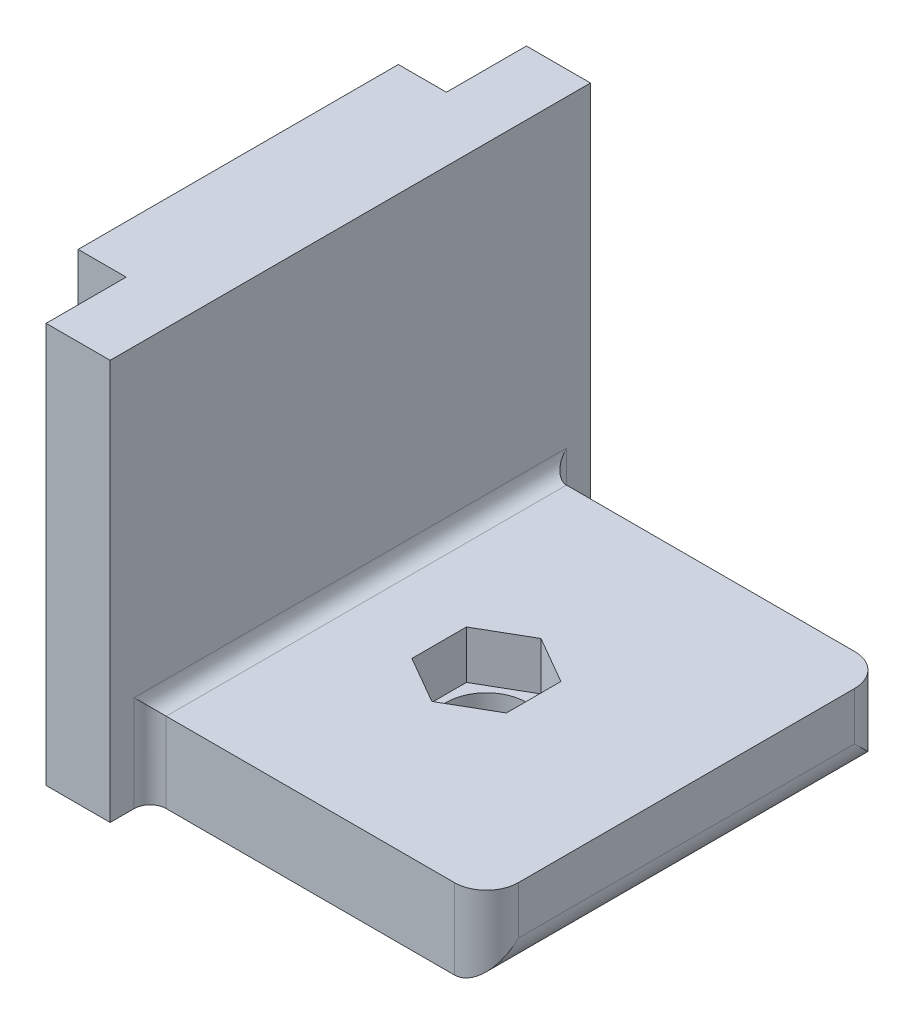
ISO-10303-21;
HEADER;
FILE_DESCRIPTION(('STEP AP214'),'2;1');
FILE_NAME('part.step','',(''),(''),'','','');
FILE_SCHEMA(('AUTOMOTIVE_DESIGN { 1 0 10303 214 1 1 1 1 }'));
ENDSEC;
DATA;
#1=APPLICATION_CONTEXT('core data for automotive mechanical design processes');
#2=APPLICATION_PROTOCOL_DEFINITION('international standard','automotive_design',2000,#1);
#3=PRODUCT_CONTEXT('',#1,'mechanical');
#4=PRODUCT('Part','Part','',(#3));
#5=PRODUCT_RELATED_PRODUCT_CATEGORY('part','',(#4));
#6=PRODUCT_DEFINITION_FORMATION('','',#4);
#7=PRODUCT_DEFINITION_CONTEXT('part definition',#1,'design');
#8=PRODUCT_DEFINITION('design','',#6,#7);
#9=PRODUCT_DEFINITION_SHAPE('','',#8);
#10=(LENGTH_UNIT() NAMED_UNIT(*) SI_UNIT(.MILLI.,.METRE.));
#11=(NAMED_UNIT(*) PLANE_ANGLE_UNIT() SI_UNIT($,.RADIAN.));
#12=(NAMED_UNIT(*) SI_UNIT($,.STERADIAN.) SOLID_ANGLE_UNIT());
#13=UNCERTAINTY_MEASURE_WITH_UNIT(LENGTH_MEASURE(1.E-05),#10,'distance_accuracy_value','');
#14=(GEOMETRIC_REPRESENTATION_CONTEXT(3) GLOBAL_UNCERTAINTY_ASSIGNED_CONTEXT((#13)) GLOBAL_UNIT_ASSIGNED_CONTEXT((#10,
#11,#12)) REPRESENTATION_CONTEXT('',''));
#15=CARTESIAN_POINT('',(0.,0.,0.));
#16=DIRECTION('',(0.,0.,1.));
#17=DIRECTION('',(1.,0.,0.));
#18=AXIS2_PLACEMENT_3D('',#15,#16,#17);
#19=CARTESIAN_POINT('',(0.,25.,0.));
#20=DIRECTION('',(0.,-1.,0.));
#21=DIRECTION('',(0.,0.,-1.));
#22=AXIS2_PLACEMENT_3D('',#19,#20,#21);
#23=CYLINDRICAL_SURFACE('',#22,2.50000000000002);
#24=CARTESIAN_POINT('',(0.,1.,0.));
#25=DIRECTION('',(0.,-1.,0.));
#26=DIRECTION('',(0.,0.,-1.));
#27=AXIS2_PLACEMENT_3D('',#24,#25,#26);
#28=CIRCLE('',#27,2.50000000000002);
#29=CARTESIAN_POINT('',(0.,1.,-2.50000000000002));
#30=VERTEX_POINT('',#29);
#31=EDGE_CURVE('E323',#30,#30,#28,.T.);
#32=ORIENTED_EDGE('',*,*,#31,.T.);
#33=EDGE_LOOP('',(#32));
#34=FACE_BOUND('',#33,.T.);
#35=CARTESIAN_POINT('',(0.,2.,0.));
#36=DIRECTION('',(0.,1.,0.));
#37=DIRECTION('',(0.,0.,1.));
#38=AXIS2_PLACEMENT_3D('',#35,#36,#37);
#39=CIRCLE('',#38,2.50000000000002);
#40=CARTESIAN_POINT('',(0.,2.,2.50000000000002));
#41=VERTEX_POINT('',#40);
#42=EDGE_CURVE('E42',#41,#41,#39,.F.);
#43=ORIENTED_EDGE('',*,*,#42,.F.);
#44=EDGE_LOOP('',(#43));
#45=FACE_BOUND('',#44,.T.);
#46=ADVANCED_FACE('F38',(#34,#45),#23,.F.);
#47=CARTESIAN_POINT('',(0.,5.,0.));
#48=DIRECTION('',(0.,-1.,0.));
#49=DIRECTION('',(0.,0.,-1.));
#50=AXIS2_PLACEMENT_3D('',#47,#48,#49);
#51=PLANE('',#50);
#52=DIRECTION('',(-0.866025403784438,0.,-0.5));
#53=VECTOR('',#52,1.);
#54=CARTESIAN_POINT('',(2.95,5.,-1.7031832941094));
#55=LINE('',#54,#53);
#56=CARTESIAN_POINT('',(2.95,5.,-1.7031832941094));
#57=VERTEX_POINT('',#56);
#58=CARTESIAN_POINT('',(0.,5.,-3.40636658821879));
#59=VERTEX_POINT('',#58);
#60=EDGE_CURVE('E225',#57,#59,#55,.T.);
#61=ORIENTED_EDGE('',*,*,#60,.F.);
#62=DIRECTION('',(0.,0.,-1.));
#63=VECTOR('',#62,1.);
#64=CARTESIAN_POINT('',(2.95,5.,1.7031832941094));
#65=LINE('',#64,#63);
#66=CARTESIAN_POINT('',(2.95,5.,1.7031832941094));
#67=VERTEX_POINT('',#66);
#68=EDGE_CURVE('E55',#67,#57,#65,.T.);
#69=ORIENTED_EDGE('',*,*,#68,.F.);
#70=DIRECTION('',(0.866025403784439,0.,-0.5));
#71=VECTOR('',#70,1.);
#72=CARTESIAN_POINT('',(0.,5.,3.40636658821879));
#73=LINE('',#72,#71);
#74=CARTESIAN_POINT('',(0.,5.,3.40636658821879));
#75=VERTEX_POINT('',#74);
#76=EDGE_CURVE('E211',#75,#67,#73,.T.);
#77=ORIENTED_EDGE('',*,*,#76,.F.);
#78=DIRECTION('',(0.866025403784438,0.,0.5));
#79=VECTOR('',#78,1.);
#80=CARTESIAN_POINT('',(-2.95,5.,1.7031832941094));
#81=LINE('',#80,#79);
#82=CARTESIAN_POINT('',(-2.95,5.,1.7031832941094));
#83=VERTEX_POINT('',#82);
#84=EDGE_CURVE('E214',#83,#75,#81,.T.);
#85=ORIENTED_EDGE('',*,*,#84,.F.);
#86=DIRECTION('',(0.,0.,1.));
#87=VECTOR('',#86,1.);
#88=CARTESIAN_POINT('',(-2.95,5.,-1.7031832941094));
#89=LINE('',#88,#87);
#90=CARTESIAN_POINT('',(-2.95,5.,-1.7031832941094));
#91=VERTEX_POINT('',#90);
#92=EDGE_CURVE('E230',#91,#83,#89,.T.);
#93=ORIENTED_EDGE('',*,*,#92,.F.);
#94=DIRECTION('',(-0.866025403784439,0.,0.5));
#95=VECTOR('',#94,1.);
#96=CARTESIAN_POINT('',(0.,5.,-3.40636658821879));
#97=LINE('',#96,#95);
#98=EDGE_CURVE('E227',#59,#91,#97,.T.);
#99=ORIENTED_EDGE('',*,*,#98,.F.);
#100=EDGE_LOOP('',(#61,#69,#77,#85,#93,#99));
#101=FACE_BOUND('',#100,.T.);
#102=DIRECTION('',(0.,0.,-1.));
#103=VECTOR('',#102,1.);
#104=CARTESIAN_POINT('',(12.5,5.,-12.5));
#105=LINE('',#104,#103);
#106=CARTESIAN_POINT('',(12.5,5.,10.5));
#107=VERTEX_POINT('',#106);
#108=CARTESIAN_POINT('',(12.5,5.,-10.5));
#109=VERTEX_POINT('',#108);
#110=EDGE_CURVE('E272',#107,#109,#105,.T.);
#111=ORIENTED_EDGE('',*,*,#110,.T.);
#112=CARTESIAN_POINT('',(10.5,5.,-10.5));
#113=DIRECTION('',(0.,-1.,0.));
#114=DIRECTION('',(0.,0.,-1.));
#115=AXIS2_PLACEMENT_3D('',#112,#113,#114);
#116=CIRCLE('',#115,2.);
#117=CARTESIAN_POINT('',(10.5,5.,-12.5));
#118=VERTEX_POINT('',#117);
#119=EDGE_CURVE('E47',#109,#118,#116,.F.);
#120=ORIENTED_EDGE('',*,*,#119,.T.);
#121=DIRECTION('',(-1.,0.,0.));
#122=VECTOR('',#121,1.);
#123=CARTESIAN_POINT('',(-8.50000000000001,5.,-12.5));
#124=LINE('',#123,#122);
#125=CARTESIAN_POINT('',(-7.50000000000001,5.,-12.5));
#126=VERTEX_POINT('',#125);
#127=EDGE_CURVE('E276',#118,#126,#124,.T.);
#128=ORIENTED_EDGE('',*,*,#127,.T.);
#129=DIRECTION('',(0.,0.,-1.));
#130=VECTOR('',#129,1.);
#131=CARTESIAN_POINT('',(-7.50000000000001,5.,12.5));
#132=LINE('',#131,#130);
#133=CARTESIAN_POINT('',(-7.50000000000001,5.,12.5));
#134=VERTEX_POINT('',#133);
#135=EDGE_CURVE('E341',#126,#134,#132,.F.);
#136=ORIENTED_EDGE('',*,*,#135,.T.);
#137=DIRECTION('',(1.,0.,0.));
#138=VECTOR('',#137,1.);
#139=CARTESIAN_POINT('',(-8.50000000000001,5.,12.5));
#140=LINE('',#139,#138);
#141=CARTESIAN_POINT('',(10.5,5.,12.5));
#142=VERTEX_POINT('',#141);
#143=EDGE_CURVE('E270',#134,#142,#140,.T.);
#144=ORIENTED_EDGE('',*,*,#143,.T.);
#145=CARTESIAN_POINT('',(10.5,5.,10.5));
#146=DIRECTION('',(0.,-1.,0.));
#147=DIRECTION('',(0.,0.,-1.));
#148=AXIS2_PLACEMENT_3D('',#145,#146,#147);
#149=CIRCLE('',#148,2.);
#150=EDGE_CURVE('E365',#142,#107,#149,.F.);
#151=ORIENTED_EDGE('',*,*,#150,.T.);
#152=EDGE_LOOP('',(#111,#120,#128,#136,#144,#151));
#153=FACE_BOUND('',#152,.T.);
#154=ADVANCED_FACE('F381',(#101,#153),#51,.F.);
#155=CARTESIAN_POINT('',(-8.50000000000001,5.,12.5));
#156=DIRECTION('',(0.,0.,-1.));
#157=DIRECTION('',(-1.,0.,0.));
#158=AXIS2_PLACEMENT_3D('',#155,#156,#157);
#159=PLANE('',#158);
#160=DIRECTION('',(1.,0.,0.));
#161=VECTOR('',#160,1.);
#162=CARTESIAN_POINT('',(-8.50000000000001,0.,12.5));
#163=LINE('',#162,#161);
#164=CARTESIAN_POINT('',(-7.50000000000001,0.,12.5));
#165=VERTEX_POINT('',#164);
#166=CARTESIAN_POINT('',(10.5,0.,12.5));
#167=VERTEX_POINT('',#166);
#168=EDGE_CURVE('E281',#165,#167,#163,.T.);
#169=ORIENTED_EDGE('',*,*,#168,.T.);
#170=DIRECTION('',(0.,-1.,0.));
#171=VECTOR('',#170,1.);
#172=CARTESIAN_POINT('',(10.5,5.,12.5));
#173=LINE('',#172,#171);
#174=EDGE_CURVE('E11',#167,#142,#173,.F.);
#175=ORIENTED_EDGE('',*,*,#174,.T.);
#176=ORIENTED_EDGE('',*,*,#143,.F.);
#177=DIRECTION('',(0.,-1.,0.));
#178=VECTOR('',#177,1.);
#179=CARTESIAN_POINT('',(-7.50000000000001,0.,12.5));
#180=LINE('',#179,#178);
#181=EDGE_CURVE('E329',#134,#165,#180,.T.);
#182=ORIENTED_EDGE('',*,*,#181,.T.);
#183=EDGE_LOOP('',(#169,#175,#176,#182));
#184=FACE_BOUND('',#183,.T.);
#185=ADVANCED_FACE('F405',(#184),#159,.F.);
#186=CARTESIAN_POINT('',(12.5,5.,-12.5));
#187=DIRECTION('',(-1.,0.,0.));
#188=DIRECTION('',(0.,0.,1.));
#189=AXIS2_PLACEMENT_3D('',#186,#187,#188);
#190=PLANE('',#189);
#191=DIRECTION('',(0.,0.,-1.));
#192=VECTOR('',#191,1.);
#193=CARTESIAN_POINT('',(12.5,2.,-12.5));
#194=LINE('',#193,#192);
#195=CARTESIAN_POINT('',(12.5,2.,10.5));
#196=VERTEX_POINT('',#195);
#197=CARTESIAN_POINT('',(12.5,2.,-10.5));
#198=VERTEX_POINT('',#197);
#199=EDGE_CURVE('E356',#196,#198,#194,.T.);
#200=ORIENTED_EDGE('',*,*,#199,.T.);
#201=DIRECTION('',(0.,-1.,0.));
#202=VECTOR('',#201,1.);
#203=CARTESIAN_POINT('',(12.5,5.,-10.5));
#204=LINE('',#203,#202);
#205=EDGE_CURVE('E359',#198,#109,#204,.F.);
#206=ORIENTED_EDGE('',*,*,#205,.T.);
#207=ORIENTED_EDGE('',*,*,#110,.F.);
#208=DIRECTION('',(0.,-1.,0.));
#209=VECTOR('',#208,1.);
#210=CARTESIAN_POINT('',(12.5,5.,10.5));
#211=LINE('',#210,#209);
#212=EDGE_CURVE('E348',#107,#196,#211,.T.);
#213=ORIENTED_EDGE('',*,*,#212,.T.);
#214=EDGE_LOOP('',(#200,#206,#207,#213));
#215=FACE_BOUND('',#214,.T.);
#216=ADVANCED_FACE('F384',(#215),#190,.F.);
#217=CARTESIAN_POINT('',(-8.50000000000001,5.,-12.5));
#218=DIRECTION('',(0.,0.,1.));
#219=DIRECTION('',(1.,0.,0.));
#220=AXIS2_PLACEMENT_3D('',#217,#218,#219);
#221=PLANE('',#220);
#222=ORIENTED_EDGE('',*,*,#127,.F.);
#223=DIRECTION('',(0.,-1.,0.));
#224=VECTOR('',#223,1.);
#225=CARTESIAN_POINT('',(10.5,5.,-12.5));
#226=LINE('',#225,#224);
#227=CARTESIAN_POINT('',(10.5,0.,-12.5));
#228=VERTEX_POINT('',#227);
#229=EDGE_CURVE('E363',#118,#228,#226,.T.);
#230=ORIENTED_EDGE('',*,*,#229,.T.);
#231=DIRECTION('',(-1.,0.,0.));
#232=VECTOR('',#231,1.);
#233=CARTESIAN_POINT('',(-8.50000000000001,0.,-12.5));
#234=LINE('',#233,#232);
#235=CARTESIAN_POINT('',(-7.50000000000001,0.,-12.5));
#236=VERTEX_POINT('',#235);
#237=EDGE_CURVE('E283',#228,#236,#234,.T.);
#238=ORIENTED_EDGE('',*,*,#237,.T.);
#239=DIRECTION('',(0.,-1.,0.));
#240=VECTOR('',#239,1.);
#241=CARTESIAN_POINT('',(-7.50000000000001,5.,-12.5));
#242=LINE('',#241,#240);
#243=EDGE_CURVE('E338',#236,#126,#242,.F.);
#244=ORIENTED_EDGE('',*,*,#243,.T.);
#245=EDGE_LOOP('',(#222,#230,#238,#244));
#246=FACE_BOUND('',#245,.T.);
#247=ADVANCED_FACE('F391',(#246),#221,.F.);
#248=CARTESIAN_POINT('',(-8.50000000000001,5.,-12.5));
#249=DIRECTION('',(-1.,0.,0.));
#250=DIRECTION('',(0.,0.,1.));
#251=AXIS2_PLACEMENT_3D('',#248,#249,#250);
#252=PLANE('',#251);
#253=DIRECTION('',(0.,0.,-1.));
#254=VECTOR('',#253,1.);
#255=CARTESIAN_POINT('',(-8.50000000000001,0.,15.));
#256=LINE('',#255,#254);
#257=CARTESIAN_POINT('',(-8.50000000000001,0.,15.));
#258=VERTEX_POINT('',#257);
#259=CARTESIAN_POINT('',(-8.50000000000001,0.,13.5));
#260=VERTEX_POINT('',#259);
#261=EDGE_CURVE('E269',#258,#260,#256,.T.);
#262=ORIENTED_EDGE('',*,*,#261,.T.);
#263=DIRECTION('',(0.,-1.,0.));
#264=VECTOR('',#263,1.);
#265=CARTESIAN_POINT('',(-8.50000000000001,5.,13.5));
#266=LINE('',#265,#264);
#267=CARTESIAN_POINT('',(-8.50000000000001,6.,13.5));
#268=VERTEX_POINT('',#267);
#269=EDGE_CURVE('E336',#260,#268,#266,.F.);
#270=ORIENTED_EDGE('',*,*,#269,.T.);
#271=DIRECTION('',(0.,0.,-1.));
#272=VECTOR('',#271,1.);
#273=CARTESIAN_POINT('',(-8.50000000000001,6.,-12.5));
#274=LINE('',#273,#272);
#275=CARTESIAN_POINT('',(-8.50000000000001,6.,-13.5));
#276=VERTEX_POINT('',#275);
#277=EDGE_CURVE('E332',#268,#276,#274,.T.);
#278=ORIENTED_EDGE('',*,*,#277,.T.);
#279=DIRECTION('',(0.,-1.,0.));
#280=VECTOR('',#279,1.);
#281=CARTESIAN_POINT('',(-8.50000000000001,0.,-13.5));
#282=LINE('',#281,#280);
#283=CARTESIAN_POINT('',(-8.50000000000001,0.,-13.5));
#284=VERTEX_POINT('',#283);
#285=EDGE_CURVE('E334',#276,#284,#282,.T.);
#286=ORIENTED_EDGE('',*,*,#285,.T.);
#287=DIRECTION('',(0.,0.,-1.));
#288=VECTOR('',#287,1.);
#289=CARTESIAN_POINT('',(-8.50000000000001,0.,-12.5));
#290=LINE('',#289,#288);
#291=CARTESIAN_POINT('',(-8.50000000000001,0.,-15.));
#292=VERTEX_POINT('',#291);
#293=EDGE_CURVE('E285',#284,#292,#290,.T.);
#294=ORIENTED_EDGE('',*,*,#293,.T.);
#295=DIRECTION('',(0.,-1.,0.));
#296=VECTOR('',#295,1.);
#297=CARTESIAN_POINT('',(-8.50000000000001,5.,-15.));
#298=LINE('',#297,#296);
#299=CARTESIAN_POINT('',(-8.50000000000001,25.,-15.));
#300=VERTEX_POINT('',#299);
#301=EDGE_CURVE('E320',#300,#292,#298,.T.);
#302=ORIENTED_EDGE('',*,*,#301,.F.);
#303=DIRECTION('',(0.,0.,-1.));
#304=VECTOR('',#303,1.);
#305=CARTESIAN_POINT('',(-8.50000000000001,25.,15.));
#306=LINE('',#305,#304);
#307=CARTESIAN_POINT('',(-8.50000000000001,25.,15.));
#308=VERTEX_POINT('',#307);
#309=EDGE_CURVE('E260',#308,#300,#306,.T.);
#310=ORIENTED_EDGE('',*,*,#309,.F.);
#311=DIRECTION('',(0.,-1.,0.));
#312=VECTOR('',#311,1.);
#313=CARTESIAN_POINT('',(-8.50000000000001,5.,15.));
#314=LINE('',#313,#312);
#315=EDGE_CURVE('E278',#308,#258,#314,.T.);
#316=ORIENTED_EDGE('',*,*,#315,.T.);
#317=EDGE_LOOP('',(#262,#270,#278,#286,#294,#302,#310,#316));
#318=FACE_BOUND('',#317,.T.);
#319=ADVANCED_FACE('F415',(#318),#252,.F.);
#320=CARTESIAN_POINT('',(-12.5,5.,-15.));
#321=DIRECTION('',(0.,0.,1.));
#322=DIRECTION('',(1.,0.,0.));
#323=AXIS2_PLACEMENT_3D('',#320,#321,#322);
#324=PLANE('',#323);
#325=DIRECTION('',(-1.,0.,0.));
#326=VECTOR('',#325,1.);
#327=CARTESIAN_POINT('',(-12.5,0.,-15.));
#328=LINE('',#327,#326);
#329=CARTESIAN_POINT('',(-12.5,0.,-15.));
#330=VERTEX_POINT('',#329);
#331=EDGE_CURVE('E287',#292,#330,#328,.T.);
#332=ORIENTED_EDGE('',*,*,#331,.T.);
#333=DIRECTION('',(0.,-1.,0.));
#334=VECTOR('',#333,1.);
#335=CARTESIAN_POINT('',(-12.5,5.,-15.));
#336=LINE('',#335,#334);
#337=CARTESIAN_POINT('',(-12.5,25.,-15.));
#338=VERTEX_POINT('',#337);
#339=EDGE_CURVE('E317',#338,#330,#336,.T.);
#340=ORIENTED_EDGE('',*,*,#339,.F.);
#341=DIRECTION('',(-1.,0.,0.));
#342=VECTOR('',#341,1.);
#343=CARTESIAN_POINT('',(-12.5,25.,-15.));
#344=LINE('',#343,#342);
#345=EDGE_CURVE('E263',#300,#338,#344,.T.);
#346=ORIENTED_EDGE('',*,*,#345,.F.);
#347=ORIENTED_EDGE('',*,*,#301,.T.);
#348=EDGE_LOOP('',(#332,#340,#346,#347));
#349=FACE_BOUND('',#348,.T.);
#350=ADVANCED_FACE('F419',(#349),#324,.F.);
#351=CARTESIAN_POINT('',(-12.5,5.,-15.));
#352=DIRECTION('',(1.,0.,0.));
#353=DIRECTION('',(0.,0.,-1.));
#354=AXIS2_PLACEMENT_3D('',#351,#352,#353);
#355=PLANE('',#354);
#356=DIRECTION('',(0.,0.,1.));
#357=VECTOR('',#356,1.);
#358=CARTESIAN_POINT('',(-12.5,0.,-15.));
#359=LINE('',#358,#357);
#360=CARTESIAN_POINT('',(-12.5,0.,-10.));
#361=VERTEX_POINT('',#360);
#362=EDGE_CURVE('E289',#330,#361,#359,.T.);
#363=ORIENTED_EDGE('',*,*,#362,.T.);
#364=DIRECTION('',(0.,-1.,0.));
#365=VECTOR('',#364,1.);
#366=CARTESIAN_POINT('',(-12.5,5.,-10.));
#367=LINE('',#366,#365);
#368=CARTESIAN_POINT('',(-12.5,25.,-10.));
#369=VERTEX_POINT('',#368);
#370=EDGE_CURVE('E314',#369,#361,#367,.T.);
#371=ORIENTED_EDGE('',*,*,#370,.F.);
#372=DIRECTION('',(0.,0.,1.));
#373=VECTOR('',#372,1.);
#374=CARTESIAN_POINT('',(-12.5,25.,-10.));
#375=LINE('',#374,#373);
#376=EDGE_CURVE('E266',#338,#369,#375,.T.);
#377=ORIENTED_EDGE('',*,*,#376,.F.);
#378=ORIENTED_EDGE('',*,*,#339,.T.);
#379=EDGE_LOOP('',(#363,#371,#377,#378));
#380=FACE_BOUND('',#379,.T.);
#381=ADVANCED_FACE('F425',(#380),#355,.F.);
#382=CARTESIAN_POINT('',(-12.5,5.,-10.));
#383=DIRECTION('',(0.,0.,1.));
#384=DIRECTION('',(1.,0.,0.));
#385=AXIS2_PLACEMENT_3D('',#382,#383,#384);
#386=PLANE('',#385);
#387=DIRECTION('',(-1.,0.,0.));
#388=VECTOR('',#387,1.);
#389=CARTESIAN_POINT('',(-12.5,0.,-10.));
#390=LINE('',#389,#388);
#391=CARTESIAN_POINT('',(-15.5,0.,-10.));
#392=VERTEX_POINT('',#391);
#393=EDGE_CURVE('E291',#361,#392,#390,.T.);
#394=ORIENTED_EDGE('',*,*,#393,.T.);
#395=DIRECTION('',(0.,-1.,0.));
#396=VECTOR('',#395,1.);
#397=CARTESIAN_POINT('',(-15.5,5.,-10.));
#398=LINE('',#397,#396);
#399=CARTESIAN_POINT('',(-15.5,25.,-10.));
#400=VERTEX_POINT('',#399);
#401=EDGE_CURVE('E311',#400,#392,#398,.T.);
#402=ORIENTED_EDGE('',*,*,#401,.F.);
#403=DIRECTION('',(-1.,0.,0.));
#404=VECTOR('',#403,1.);
#405=CARTESIAN_POINT('',(-12.5,25.,-10.));
#406=LINE('',#405,#404);
#407=EDGE_CURVE('E244',#369,#400,#406,.T.);
#408=ORIENTED_EDGE('',*,*,#407,.F.);
#409=ORIENTED_EDGE('',*,*,#370,.T.);
#410=EDGE_LOOP('',(#394,#402,#408,#409));
#411=FACE_BOUND('',#410,.T.);
#412=ADVANCED_FACE('F428',(#411),#386,.F.);
#413=CARTESIAN_POINT('',(-15.5,5.,-10.));
#414=DIRECTION('',(1.,0.,0.));
#415=DIRECTION('',(0.,0.,-1.));
#416=AXIS2_PLACEMENT_3D('',#413,#414,#415);
#417=PLANE('',#416);
#418=DIRECTION('',(0.,0.,1.));
#419=VECTOR('',#418,1.);
#420=CARTESIAN_POINT('',(-15.5,0.,-10.));
#421=LINE('',#420,#419);
#422=CARTESIAN_POINT('',(-15.5,0.,9.99999999999999));
#423=VERTEX_POINT('',#422);
#424=EDGE_CURVE('E293',#392,#423,#421,.T.);
#425=ORIENTED_EDGE('',*,*,#424,.T.);
#426=DIRECTION('',(0.,-1.,0.));
#427=VECTOR('',#426,1.);
#428=CARTESIAN_POINT('',(-15.5,5.,9.99999999999999));
#429=LINE('',#428,#427);
#430=CARTESIAN_POINT('',(-15.5,25.,9.99999999999999));
#431=VERTEX_POINT('',#430);
#432=EDGE_CURVE('E308',#431,#423,#429,.T.);
#433=ORIENTED_EDGE('',*,*,#432,.F.);
#434=DIRECTION('',(0.,0.,1.));
#435=VECTOR('',#434,1.);
#436=CARTESIAN_POINT('',(-15.5,25.,-10.));
#437=LINE('',#436,#435);
#438=EDGE_CURVE('E247',#400,#431,#437,.T.);
#439=ORIENTED_EDGE('',*,*,#438,.F.);
#440=ORIENTED_EDGE('',*,*,#401,.T.);
#441=EDGE_LOOP('',(#425,#433,#439,#440));
#442=FACE_BOUND('',#441,.T.);
#443=ADVANCED_FACE('F433',(#442),#417,.F.);
#444=CARTESIAN_POINT('',(-12.5,5.,9.99999999999999));
#445=DIRECTION('',(0.,0.,-1.));
#446=DIRECTION('',(-1.,0.,0.));
#447=AXIS2_PLACEMENT_3D('',#444,#445,#446);
#448=PLANE('',#447);
#449=DIRECTION('',(1.,0.,0.));
#450=VECTOR('',#449,1.);
#451=CARTESIAN_POINT('',(-12.5,0.,9.99999999999999));
#452=LINE('',#451,#450);
#453=CARTESIAN_POINT('',(-12.5,0.,9.99999999999999));
#454=VERTEX_POINT('',#453);
#455=EDGE_CURVE('E295',#423,#454,#452,.T.);
#456=ORIENTED_EDGE('',*,*,#455,.T.);
#457=DIRECTION('',(0.,-1.,0.));
#458=VECTOR('',#457,1.);
#459=CARTESIAN_POINT('',(-12.5,5.,9.99999999999999));
#460=LINE('',#459,#458);
#461=CARTESIAN_POINT('',(-12.5,25.,9.99999999999999));
#462=VERTEX_POINT('',#461);
#463=EDGE_CURVE('E305',#462,#454,#460,.T.);
#464=ORIENTED_EDGE('',*,*,#463,.F.);
#465=DIRECTION('',(1.,0.,0.));
#466=VECTOR('',#465,1.);
#467=CARTESIAN_POINT('',(-12.5,25.,9.99999999999999));
#468=LINE('',#467,#466);
#469=EDGE_CURVE('E251',#431,#462,#468,.T.);
#470=ORIENTED_EDGE('',*,*,#469,.F.);
#471=ORIENTED_EDGE('',*,*,#432,.T.);
#472=EDGE_LOOP('',(#456,#464,#470,#471));
#473=FACE_BOUND('',#472,.T.);
#474=ADVANCED_FACE('F437',(#473),#448,.F.);
#475=CARTESIAN_POINT('',(-12.5,5.,9.99999999999999));
#476=DIRECTION('',(1.,0.,0.));
#477=DIRECTION('',(0.,0.,-1.));
#478=AXIS2_PLACEMENT_3D('',#475,#476,#477);
#479=PLANE('',#478);
#480=DIRECTION('',(0.,0.,1.));
#481=VECTOR('',#480,1.);
#482=CARTESIAN_POINT('',(-12.5,0.,9.99999999999999));
#483=LINE('',#482,#481);
#484=CARTESIAN_POINT('',(-12.5,0.,15.));
#485=VERTEX_POINT('',#484);
#486=EDGE_CURVE('E297',#454,#485,#483,.T.);
#487=ORIENTED_EDGE('',*,*,#486,.T.);
#488=DIRECTION('',(0.,-1.,0.));
#489=VECTOR('',#488,1.);
#490=CARTESIAN_POINT('',(-12.5,5.,15.));
#491=LINE('',#490,#489);
#492=CARTESIAN_POINT('',(-12.5,25.,15.));
#493=VERTEX_POINT('',#492);
#494=EDGE_CURVE('E302',#493,#485,#491,.T.);
#495=ORIENTED_EDGE('',*,*,#494,.F.);
#496=DIRECTION('',(0.,0.,1.));
#497=VECTOR('',#496,1.);
#498=CARTESIAN_POINT('',(-12.5,25.,15.));
#499=LINE('',#498,#497);
#500=EDGE_CURVE('E254',#462,#493,#499,.T.);
#501=ORIENTED_EDGE('',*,*,#500,.F.);
#502=ORIENTED_EDGE('',*,*,#463,.T.);
#503=EDGE_LOOP('',(#487,#495,#501,#502));
#504=FACE_BOUND('',#503,.T.);
#505=ADVANCED_FACE('F441',(#504),#479,.F.);
#506=CARTESIAN_POINT('',(-12.5,5.,15.));
#507=DIRECTION('',(0.,0.,-1.));
#508=DIRECTION('',(-1.,0.,0.));
#509=AXIS2_PLACEMENT_3D('',#506,#507,#508);
#510=PLANE('',#509);
#511=DIRECTION('',(1.,0.,0.));
#512=VECTOR('',#511,1.);
#513=CARTESIAN_POINT('',(-12.5,0.,15.));
#514=LINE('',#513,#512);
#515=EDGE_CURVE('E273',#485,#258,#514,.T.);
#516=ORIENTED_EDGE('',*,*,#515,.T.);
#517=ORIENTED_EDGE('',*,*,#315,.F.);
#518=DIRECTION('',(1.,0.,0.));
#519=VECTOR('',#518,1.);
#520=CARTESIAN_POINT('',(-12.5,25.,15.));
#521=LINE('',#520,#519);
#522=EDGE_CURVE('E257',#493,#308,#521,.T.);
#523=ORIENTED_EDGE('',*,*,#522,.F.);
#524=ORIENTED_EDGE('',*,*,#494,.T.);
#525=EDGE_LOOP('',(#516,#517,#523,#524));
#526=FACE_BOUND('',#525,.T.);
#527=ADVANCED_FACE('F444',(#526),#510,.F.);
#528=CARTESIAN_POINT('',(0.,0.,0.));
#529=DIRECTION('',(0.,-1.,0.));
#530=DIRECTION('',(0.,0.,-1.));
#531=AXIS2_PLACEMENT_3D('',#528,#529,#530);
#532=PLANE('',#531);
#533=CARTESIAN_POINT('',(0.,0.,0.));
#534=DIRECTION('',(0.,-1.,0.));
#535=DIRECTION('',(0.,0.,-1.));
#536=AXIS2_PLACEMENT_3D('',#533,#534,#535);
#537=CIRCLE('',#536,3.50000000000002);
#538=CARTESIAN_POINT('',(0.,0.,-3.50000000000002));
#539=VERTEX_POINT('',#538);
#540=EDGE_CURVE('E326',#539,#539,#537,.F.);
#541=ORIENTED_EDGE('',*,*,#540,.T.);
#542=EDGE_LOOP('',(#541));
#543=FACE_BOUND('',#542,.T.);
#544=ORIENTED_EDGE('',*,*,#237,.F.);
#545=DIRECTION('',(0.,0.,-1.));
#546=VECTOR('',#545,1.);
#547=CARTESIAN_POINT('',(10.5,0.,12.5));
#548=LINE('',#547,#546);
#549=EDGE_CURVE('E361',#228,#167,#548,.F.);
#550=ORIENTED_EDGE('',*,*,#549,.T.);
#551=ORIENTED_EDGE('',*,*,#168,.F.);
#552=CARTESIAN_POINT('',(-7.50000000000001,0.,13.5));
#553=DIRECTION('',(0.,-1.,0.));
#554=DIRECTION('',(0.,0.,-1.));
#555=AXIS2_PLACEMENT_3D('',#552,#553,#554);
#556=CIRCLE('',#555,1.);
#557=EDGE_CURVE('E343',#165,#260,#556,.F.);
#558=ORIENTED_EDGE('',*,*,#557,.T.);
#559=ORIENTED_EDGE('',*,*,#261,.F.);
#560=ORIENTED_EDGE('',*,*,#515,.F.);
#561=ORIENTED_EDGE('',*,*,#486,.F.);
#562=ORIENTED_EDGE('',*,*,#455,.F.);
#563=ORIENTED_EDGE('',*,*,#424,.F.);
#564=ORIENTED_EDGE('',*,*,#393,.F.);
#565=ORIENTED_EDGE('',*,*,#362,.F.);
#566=ORIENTED_EDGE('',*,*,#331,.F.);
#567=ORIENTED_EDGE('',*,*,#293,.F.);
#568=CARTESIAN_POINT('',(-7.50000000000001,0.,-13.5));
#569=DIRECTION('',(0.,-1.,0.));
#570=DIRECTION('',(0.,0.,-1.));
#571=AXIS2_PLACEMENT_3D('',#568,#569,#570);
#572=CIRCLE('',#571,1.);
#573=EDGE_CURVE('E345',#284,#236,#572,.F.);
#574=ORIENTED_EDGE('',*,*,#573,.T.);
#575=EDGE_LOOP('',(#544,#550,#551,#558,#559,#560,#561,#562,#563,#564,#565,#566,#567,#574));
#576=FACE_BOUND('',#575,.T.);
#577=ADVANCED_FACE('F409',(#543,#576),#532,.T.);
#578=CARTESIAN_POINT('',(0.,25.,0.));
#579=DIRECTION('',(0.,1.,0.));
#580=DIRECTION('',(0.,0.,1.));
#581=AXIS2_PLACEMENT_3D('',#578,#579,#580);
#582=PLANE('',#581);
#583=ORIENTED_EDGE('',*,*,#407,.T.);
#584=ORIENTED_EDGE('',*,*,#438,.T.);
#585=ORIENTED_EDGE('',*,*,#469,.T.);
#586=ORIENTED_EDGE('',*,*,#500,.T.);
#587=ORIENTED_EDGE('',*,*,#522,.T.);
#588=ORIENTED_EDGE('',*,*,#309,.T.);
#589=ORIENTED_EDGE('',*,*,#345,.T.);
#590=ORIENTED_EDGE('',*,*,#376,.T.);
#591=EDGE_LOOP('',(#583,#584,#585,#586,#587,#588,#589,#590));
#592=FACE_BOUND('',#591,.T.);
#593=ADVANCED_FACE('F422',(#592),#582,.T.);
#594=CARTESIAN_POINT('',(0.,1.,0.));
#595=DIRECTION('',(0.,-1.,0.));
#596=DIRECTION('',(0.,0.,-1.));
#597=AXIS2_PLACEMENT_3D('',#594,#595,#596);
#598=TOROIDAL_SURFACE('',#597,3.50000000000002,1.);
#599=ORIENTED_EDGE('',*,*,#540,.F.);
#600=EDGE_LOOP('',(#599));
#601=FACE_BOUND('',#600,.T.);
#602=ORIENTED_EDGE('',*,*,#31,.F.);
#603=EDGE_LOOP('',(#602));
#604=FACE_BOUND('',#603,.T.);
#605=ADVANCED_FACE('F468',(#601,#604),#598,.T.);
#606=CARTESIAN_POINT('',(-7.50000000000001,5.,-13.5));
#607=DIRECTION('',(0.,1.,0.));
#608=DIRECTION('',(0.,0.,1.));
#609=AXIS2_PLACEMENT_3D('',#606,#607,#608);
#610=CYLINDRICAL_SURFACE('',#609,1.);
#611=ORIENTED_EDGE('',*,*,#573,.F.);
#612=ORIENTED_EDGE('',*,*,#285,.F.);
#613=CARTESIAN_POINT('',(-7.50000000000001,6.,-13.5));
#614=DIRECTION('',(0.,0.707106781186547,0.707106781186547));
#615=DIRECTION('',(0.,-0.707106781186547,0.707106781186547));
#616=AXIS2_PLACEMENT_3D('',#613,#614,#615);
#617=ELLIPSE('',#616,1.41421356237309,1.);
#618=EDGE_CURVE('E248',#126,#276,#617,.F.);
#619=ORIENTED_EDGE('',*,*,#618,.F.);
#620=ORIENTED_EDGE('',*,*,#243,.F.);
#621=EDGE_LOOP('',(#611,#612,#619,#620));
#622=FACE_BOUND('',#621,.T.);
#623=ADVANCED_FACE('F399',(#622),#610,.F.);
#624=CARTESIAN_POINT('',(-7.50000000000001,6.,-12.5));
#625=DIRECTION('',(0.,0.,1.));
#626=DIRECTION('',(1.,0.,0.));
#627=AXIS2_PLACEMENT_3D('',#624,#625,#626);
#628=CYLINDRICAL_SURFACE('',#627,1.);
#629=ORIENTED_EDGE('',*,*,#618,.T.);
#630=ORIENTED_EDGE('',*,*,#277,.F.);
#631=CARTESIAN_POINT('',(-7.50000000000001,6.,13.5));
#632=DIRECTION('',(0.,-0.707106781186547,0.707106781186547));
#633=DIRECTION('',(0.,0.707106781186547,0.707106781186547));
#634=AXIS2_PLACEMENT_3D('',#631,#632,#633);
#635=ELLIPSE('',#634,1.41421356237309,1.);
#636=EDGE_CURVE('E349',#134,#268,#635,.F.);
#637=ORIENTED_EDGE('',*,*,#636,.F.);
#638=ORIENTED_EDGE('',*,*,#135,.F.);
#639=EDGE_LOOP('',(#629,#630,#637,#638));
#640=FACE_BOUND('',#639,.T.);
#641=ADVANCED_FACE('F403',(#640),#628,.F.);
#642=CARTESIAN_POINT('',(-7.50000000000001,5.,13.5));
#643=DIRECTION('',(0.,1.,0.));
#644=DIRECTION('',(0.,0.,1.));
#645=AXIS2_PLACEMENT_3D('',#642,#643,#644);
#646=CYLINDRICAL_SURFACE('',#645,1.);
#647=ORIENTED_EDGE('',*,*,#636,.T.);
#648=ORIENTED_EDGE('',*,*,#269,.F.);
#649=ORIENTED_EDGE('',*,*,#557,.F.);
#650=ORIENTED_EDGE('',*,*,#181,.F.);
#651=EDGE_LOOP('',(#647,#648,#649,#650));
#652=FACE_BOUND('',#651,.T.);
#653=ADVANCED_FACE('F446',(#652),#646,.F.);
#654=CARTESIAN_POINT('',(10.5,5.,10.5));
#655=DIRECTION('',(0.,-1.,0.));
#656=DIRECTION('',(0.,0.,-1.));
#657=AXIS2_PLACEMENT_3D('',#654,#655,#656);
#658=CYLINDRICAL_SURFACE('',#657,2.);
#659=ORIENTED_EDGE('',*,*,#150,.F.);
#660=ORIENTED_EDGE('',*,*,#174,.F.);
#661=CARTESIAN_POINT('',(10.5,2.,10.5));
#662=DIRECTION('',(0.,-0.707106781186547,-0.707106781186547));
#663=DIRECTION('',(0.,-0.707106781186547,0.707106781186547));
#664=AXIS2_PLACEMENT_3D('',#661,#662,#663);
#665=ELLIPSE('',#664,2.82842712474619,2.);
#666=EDGE_CURVE('E352',#196,#167,#665,.T.);
#667=ORIENTED_EDGE('',*,*,#666,.F.);
#668=ORIENTED_EDGE('',*,*,#212,.F.);
#669=EDGE_LOOP('',(#659,#660,#667,#668));
#670=FACE_BOUND('',#669,.T.);
#671=ADVANCED_FACE('F40',(#670),#658,.T.);
#672=CARTESIAN_POINT('',(10.5,5.,-10.5));
#673=DIRECTION('',(0.,-1.,0.));
#674=DIRECTION('',(0.,0.,-1.));
#675=AXIS2_PLACEMENT_3D('',#672,#673,#674);
#676=CYLINDRICAL_SURFACE('',#675,2.);
#677=ORIENTED_EDGE('',*,*,#119,.F.);
#678=ORIENTED_EDGE('',*,*,#205,.F.);
#679=CARTESIAN_POINT('',(10.5,2.,-10.5));
#680=DIRECTION('',(0.,-0.707106781186547,0.707106781186547));
#681=DIRECTION('',(0.,-0.707106781186547,-0.707106781186547));
#682=AXIS2_PLACEMENT_3D('',#679,#680,#681);
#683=ELLIPSE('',#682,2.82842712474619,2.);
#684=EDGE_CURVE('E368',#228,#198,#683,.T.);
#685=ORIENTED_EDGE('',*,*,#684,.F.);
#686=ORIENTED_EDGE('',*,*,#229,.F.);
#687=EDGE_LOOP('',(#677,#678,#685,#686));
#688=FACE_BOUND('',#687,.T.);
#689=ADVANCED_FACE('F387',(#688),#676,.T.);
#690=CARTESIAN_POINT('',(10.5,2.,-12.5));
#691=DIRECTION('',(0.,0.,1.));
#692=DIRECTION('',(1.,0.,0.));
#693=AXIS2_PLACEMENT_3D('',#690,#691,#692);
#694=CYLINDRICAL_SURFACE('',#693,2.);
#695=ORIENTED_EDGE('',*,*,#666,.T.);
#696=ORIENTED_EDGE('',*,*,#549,.F.);
#697=ORIENTED_EDGE('',*,*,#684,.T.);
#698=ORIENTED_EDGE('',*,*,#199,.F.);
#699=EDGE_LOOP('',(#695,#696,#697,#698));
#700=FACE_BOUND('',#699,.T.);
#701=ADVANCED_FACE('F374',(#700),#694,.T.);
#702=CARTESIAN_POINT('',(0.,2.,0.));
#703=DIRECTION('',(0.,1.,0.));
#704=DIRECTION('',(0.,0.,1.));
#705=AXIS2_PLACEMENT_3D('',#702,#703,#704);
#706=PLANE('',#705);
#707=DIRECTION('',(0.,0.,-1.));
#708=VECTOR('',#707,1.);
#709=CARTESIAN_POINT('',(2.95,2.,1.7031832941094));
#710=LINE('',#709,#708);
#711=CARTESIAN_POINT('',(2.95,2.,1.7031832941094));
#712=VERTEX_POINT('',#711);
#713=CARTESIAN_POINT('',(2.95,2.,-1.7031832941094));
#714=VERTEX_POINT('',#713);
#715=EDGE_CURVE('E191',#712,#714,#710,.T.);
#716=ORIENTED_EDGE('',*,*,#715,.T.);
#717=DIRECTION('',(-0.866025403784438,0.,-0.5));
#718=VECTOR('',#717,1.);
#719=CARTESIAN_POINT('',(2.95,2.,-1.7031832941094));
#720=LINE('',#719,#718);
#721=CARTESIAN_POINT('',(0.,2.,-3.40636658821879));
#722=VERTEX_POINT('',#721);
#723=EDGE_CURVE('E200',#714,#722,#720,.T.);
#724=ORIENTED_EDGE('',*,*,#723,.T.);
#725=DIRECTION('',(-0.866025403784439,0.,0.5));
#726=VECTOR('',#725,1.);
#727=CARTESIAN_POINT('',(0.,2.,-3.40636658821879));
#728=LINE('',#727,#726);
#729=CARTESIAN_POINT('',(-2.95,2.,-1.7031832941094));
#730=VERTEX_POINT('',#729);
#731=EDGE_CURVE('E205',#722,#730,#728,.T.);
#732=ORIENTED_EDGE('',*,*,#731,.T.);
#733=DIRECTION('',(0.,0.,1.));
#734=VECTOR('',#733,1.);
#735=CARTESIAN_POINT('',(-2.95,2.,-1.7031832941094));
#736=LINE('',#735,#734);
#737=CARTESIAN_POINT('',(-2.95,2.,1.7031832941094));
#738=VERTEX_POINT('',#737);
#739=EDGE_CURVE('E218',#730,#738,#736,.T.);
#740=ORIENTED_EDGE('',*,*,#739,.T.);
#741=DIRECTION('',(0.866025403784438,0.,0.5));
#742=VECTOR('',#741,1.);
#743=CARTESIAN_POINT('',(-2.95,2.,1.7031832941094));
#744=LINE('',#743,#742);
#745=CARTESIAN_POINT('',(0.,2.,3.40636658821879));
#746=VERTEX_POINT('',#745);
#747=EDGE_CURVE('E221',#738,#746,#744,.T.);
#748=ORIENTED_EDGE('',*,*,#747,.T.);
#749=DIRECTION('',(0.866025403784439,0.,-0.5));
#750=VECTOR('',#749,1.);
#751=CARTESIAN_POINT('',(0.,2.,3.40636658821879));
#752=LINE('',#751,#750);
#753=EDGE_CURVE('E197',#746,#712,#752,.T.);
#754=ORIENTED_EDGE('',*,*,#753,.T.);
#755=EDGE_LOOP('',(#716,#724,#732,#740,#748,#754));
#756=FACE_BOUND('',#755,.T.);
#757=ORIENTED_EDGE('',*,*,#42,.T.);
#758=EDGE_LOOP('',(#757));
#759=FACE_BOUND('',#758,.T.);
#760=ADVANCED_FACE('F207',(#756,#759),#706,.T.);
#761=CARTESIAN_POINT('',(2.95,2.,1.7031832941094));
#762=DIRECTION('',(1.,0.,0.));
#763=DIRECTION('',(0.,0.,-1.));
#764=AXIS2_PLACEMENT_3D('',#761,#762,#763);
#765=PLANE('',#764);
#766=ORIENTED_EDGE('',*,*,#68,.T.);
#767=DIRECTION('',(0.,1.,0.));
#768=VECTOR('',#767,1.);
#769=CARTESIAN_POINT('',(2.95,2.,-1.7031832941094));
#770=LINE('',#769,#768);
#771=EDGE_CURVE('E187',#714,#57,#770,.T.);
#772=ORIENTED_EDGE('',*,*,#771,.F.);
#773=ORIENTED_EDGE('',*,*,#715,.F.);
#774=DIRECTION('',(0.,1.,0.));
#775=VECTOR('',#774,1.);
#776=CARTESIAN_POINT('',(2.95,2.,1.7031832941094));
#777=LINE('',#776,#775);
#778=EDGE_CURVE('E235',#712,#67,#777,.T.);
#779=ORIENTED_EDGE('',*,*,#778,.T.);
#780=EDGE_LOOP('',(#766,#772,#773,#779));
#781=FACE_BOUND('',#780,.T.);
#782=ADVANCED_FACE('F189',(#781),#765,.F.);
#783=CARTESIAN_POINT('',(0.,2.,3.40636658821879));
#784=DIRECTION('',(0.5,0.,0.866025403784439));
#785=DIRECTION('',(0.866025403784439,0.,-0.5));
#786=AXIS2_PLACEMENT_3D('',#783,#784,#785);
#787=PLANE('',#786);
#788=ORIENTED_EDGE('',*,*,#76,.T.);
#789=ORIENTED_EDGE('',*,*,#778,.F.);
#790=ORIENTED_EDGE('',*,*,#753,.F.);
#791=DIRECTION('',(0.,1.,0.));
#792=VECTOR('',#791,1.);
#793=CARTESIAN_POINT('',(0.,2.,3.40636658821879));
#794=LINE('',#793,#792);
#795=EDGE_CURVE('E237',#746,#75,#794,.T.);
#796=ORIENTED_EDGE('',*,*,#795,.T.);
#797=EDGE_LOOP('',(#788,#789,#790,#796));
#798=FACE_BOUND('',#797,.T.);
#799=ADVANCED_FACE('F529',(#798),#787,.F.);
#800=CARTESIAN_POINT('',(-2.95,2.,1.7031832941094));
#801=DIRECTION('',(-0.5,0.,0.866025403784439));
#802=DIRECTION('',(0.866025403784439,0.,0.5));
#803=AXIS2_PLACEMENT_3D('',#800,#801,#802);
#804=PLANE('',#803);
#805=ORIENTED_EDGE('',*,*,#84,.T.);
#806=ORIENTED_EDGE('',*,*,#795,.F.);
#807=ORIENTED_EDGE('',*,*,#747,.F.);
#808=DIRECTION('',(0.,1.,0.));
#809=VECTOR('',#808,1.);
#810=CARTESIAN_POINT('',(-2.95,2.,1.7031832941094));
#811=LINE('',#810,#809);
#812=EDGE_CURVE('E239',#738,#83,#811,.T.);
#813=ORIENTED_EDGE('',*,*,#812,.T.);
#814=EDGE_LOOP('',(#805,#806,#807,#813));
#815=FACE_BOUND('',#814,.T.);
#816=ADVANCED_FACE('F535',(#815),#804,.F.);
#817=CARTESIAN_POINT('',(-2.95,2.,-1.7031832941094));
#818=DIRECTION('',(-1.,0.,0.));
#819=DIRECTION('',(0.,0.,1.));
#820=AXIS2_PLACEMENT_3D('',#817,#818,#819);
#821=PLANE('',#820);
#822=ORIENTED_EDGE('',*,*,#92,.T.);
#823=ORIENTED_EDGE('',*,*,#812,.F.);
#824=ORIENTED_EDGE('',*,*,#739,.F.);
#825=DIRECTION('',(0.,1.,0.));
#826=VECTOR('',#825,1.);
#827=CARTESIAN_POINT('',(-2.95,2.,-1.7031832941094));
#828=LINE('',#827,#826);
#829=EDGE_CURVE('E241',#730,#91,#828,.T.);
#830=ORIENTED_EDGE('',*,*,#829,.T.);
#831=EDGE_LOOP('',(#822,#823,#824,#830));
#832=FACE_BOUND('',#831,.T.);
#833=ADVANCED_FACE('F543',(#832),#821,.F.);
#834=CARTESIAN_POINT('',(0.,2.,-3.40636658821879));
#835=DIRECTION('',(-0.5,0.,-0.866025403784439));
#836=DIRECTION('',(-0.866025403784439,0.,0.5));
#837=AXIS2_PLACEMENT_3D('',#834,#835,#836);
#838=PLANE('',#837);
#839=ORIENTED_EDGE('',*,*,#98,.T.);
#840=ORIENTED_EDGE('',*,*,#829,.F.);
#841=ORIENTED_EDGE('',*,*,#731,.F.);
#842=DIRECTION('',(0.,1.,0.));
#843=VECTOR('',#842,1.);
#844=CARTESIAN_POINT('',(0.,2.,-3.40636658821879));
#845=LINE('',#844,#843);
#846=EDGE_CURVE('E196',#722,#59,#845,.T.);
#847=ORIENTED_EDGE('',*,*,#846,.T.);
#848=EDGE_LOOP('',(#839,#840,#841,#847));
#849=FACE_BOUND('',#848,.T.);
#850=ADVANCED_FACE('F551',(#849),#838,.F.);
#851=CARTESIAN_POINT('',(2.95,2.,-1.7031832941094));
#852=DIRECTION('',(0.5,0.,-0.866025403784439));
#853=DIRECTION('',(-0.866025403784439,0.,-0.5));
#854=AXIS2_PLACEMENT_3D('',#851,#852,#853);
#855=PLANE('',#854);
#856=ORIENTED_EDGE('',*,*,#60,.T.);
#857=ORIENTED_EDGE('',*,*,#846,.F.);
#858=ORIENTED_EDGE('',*,*,#723,.F.);
#859=ORIENTED_EDGE('',*,*,#771,.T.);
#860=EDGE_LOOP('',(#856,#857,#858,#859));
#861=FACE_BOUND('',#860,.T.);
#862=ADVANCED_FACE('F201',(#861),#855,.F.);
#863=CLOSED_SHELL('',(#46,#154,#185,#216,#247,#319,#350,#381,#412,#443,#474,#505,#527,#577,#593,
#605,#623,#641,#653,#671,#689,#701,#760,#782,#799,#816,#833,#850,#862));
#864=MANIFOLD_SOLID_BREP('B2',#863);
#865=ADVANCED_BREP_SHAPE_REPRESENTATION('',(#18,#864),#14);
#866=SHAPE_DEFINITION_REPRESENTATION(#9,#865);
ENDSEC;
END-ISO-10303-21;
